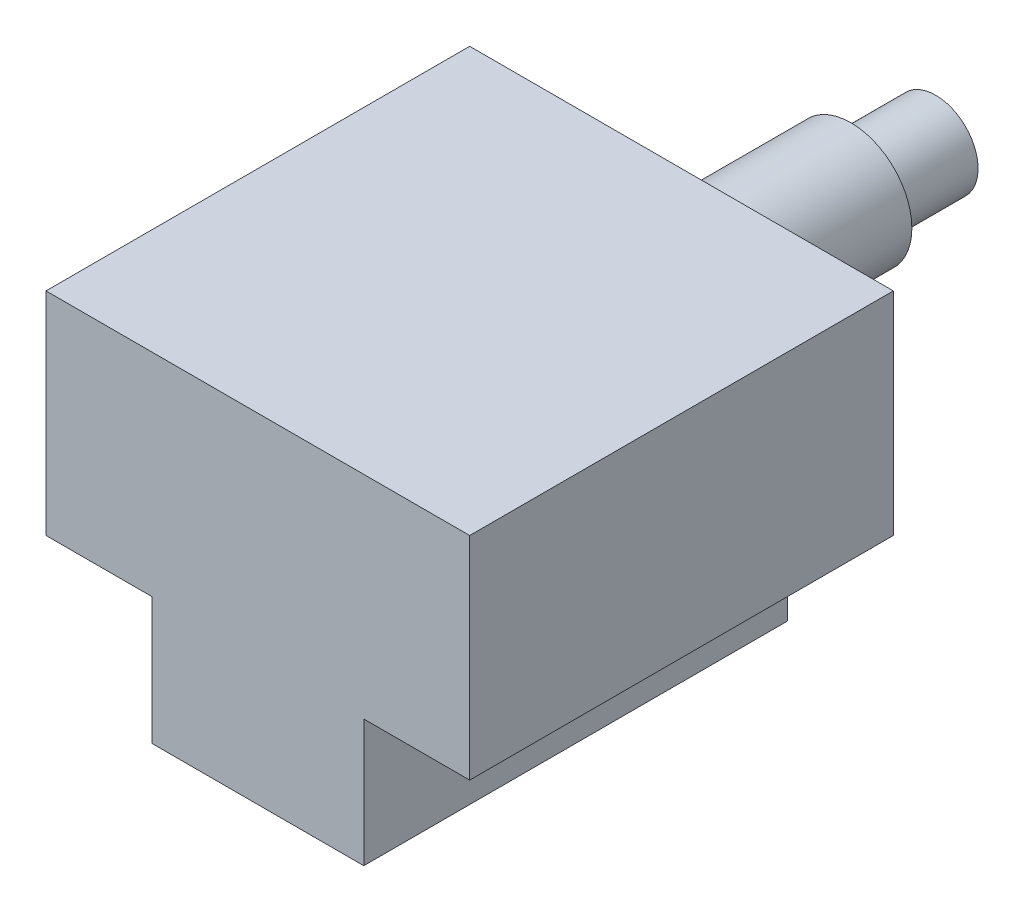
ISO-10303-21;
HEADER;
FILE_DESCRIPTION(('STEP AP214'),'2;1');
FILE_NAME('part.step','',(''),(''),'','','');
FILE_SCHEMA(('AUTOMOTIVE_DESIGN { 1 0 10303 214 1 1 1 1 }'));
ENDSEC;
DATA;
#1=APPLICATION_CONTEXT('core data for automotive mechanical design processes');
#2=APPLICATION_PROTOCOL_DEFINITION('international standard','automotive_design',2000,#1);
#3=PRODUCT_CONTEXT('',#1,'mechanical');
#4=PRODUCT('Part','Part','',(#3));
#5=PRODUCT_RELATED_PRODUCT_CATEGORY('part','',(#4));
#6=PRODUCT_DEFINITION_FORMATION('','',#4);
#7=PRODUCT_DEFINITION_CONTEXT('part definition',#1,'design');
#8=PRODUCT_DEFINITION('design','',#6,#7);
#9=PRODUCT_DEFINITION_SHAPE('','',#8);
#10=(LENGTH_UNIT() NAMED_UNIT(*) SI_UNIT(.MILLI.,.METRE.));
#11=(NAMED_UNIT(*) PLANE_ANGLE_UNIT() SI_UNIT($,.RADIAN.));
#12=(NAMED_UNIT(*) SI_UNIT($,.STERADIAN.) SOLID_ANGLE_UNIT());
#13=UNCERTAINTY_MEASURE_WITH_UNIT(LENGTH_MEASURE(1.E-05),#10,'distance_accuracy_value','');
#14=(GEOMETRIC_REPRESENTATION_CONTEXT(3) GLOBAL_UNCERTAINTY_ASSIGNED_CONTEXT((#13)) GLOBAL_UNIT_ASSIGNED_CONTEXT((#10,
#11,#12)) REPRESENTATION_CONTEXT('',''));
#15=CARTESIAN_POINT('',(0.,0.,0.));
#16=DIRECTION('',(0.,0.,1.));
#17=DIRECTION('',(1.,0.,0.));
#18=AXIS2_PLACEMENT_3D('',#15,#16,#17);
#19=CARTESIAN_POINT('',(50.,0.,50.));
#20=DIRECTION('',(1.,0.,0.));
#21=DIRECTION('',(0.,1.,0.));
#22=AXIS2_PLACEMENT_3D('',#19,#20,#21);
#23=PLANE('',#22);
#24=DIRECTION('',(0.,-1.,0.));
#25=VECTOR('',#24,1.);
#26=CARTESIAN_POINT('',(50.,0.,-50.));
#27=LINE('',#26,#25);
#28=CARTESIAN_POINT('',(50.,25.,-50.));
#29=VERTEX_POINT('',#28);
#30=CARTESIAN_POINT('',(50.,-25.,-50.));
#31=VERTEX_POINT('',#30);
#32=EDGE_CURVE('E139',#29,#31,#27,.T.);
#33=ORIENTED_EDGE('',*,*,#32,.F.);
#34=DIRECTION('',(0.,0.,-1.));
#35=VECTOR('',#34,1.);
#36=CARTESIAN_POINT('',(50.,25.,50.));
#37=LINE('',#36,#35);
#38=CARTESIAN_POINT('',(50.,25.,50.));
#39=VERTEX_POINT('',#38);
#40=EDGE_CURVE('E96',#39,#29,#37,.T.);
#41=ORIENTED_EDGE('',*,*,#40,.F.);
#42=DIRECTION('',(0.,-1.,0.));
#43=VECTOR('',#42,1.);
#44=CARTESIAN_POINT('',(50.,0.,50.));
#45=LINE('',#44,#43);
#46=CARTESIAN_POINT('',(50.,-25.,50.));
#47=VERTEX_POINT('',#46);
#48=EDGE_CURVE('E188',#39,#47,#45,.T.);
#49=ORIENTED_EDGE('',*,*,#48,.T.);
#50=DIRECTION('',(0.,0.,-1.));
#51=VECTOR('',#50,1.);
#52=CARTESIAN_POINT('',(50.,-25.,50.));
#53=LINE('',#52,#51);
#54=EDGE_CURVE('E91',#47,#31,#53,.T.);
#55=ORIENTED_EDGE('',*,*,#54,.T.);
#56=EDGE_LOOP('',(#33,#41,#49,#55));
#57=FACE_BOUND('',#56,.T.);
#58=ADVANCED_FACE('F40',(#57),#23,.T.);
#59=CARTESIAN_POINT('',(0.,25.,50.));
#60=DIRECTION('',(0.,1.,0.));
#61=DIRECTION('',(0.,0.,1.));
#62=AXIS2_PLACEMENT_3D('',#59,#60,#61);
#63=PLANE('',#62);
#64=DIRECTION('',(1.,0.,0.));
#65=VECTOR('',#64,1.);
#66=CARTESIAN_POINT('',(0.,25.,-50.));
#67=LINE('',#66,#65);
#68=CARTESIAN_POINT('',(-50.,25.,-50.));
#69=VERTEX_POINT('',#68);
#70=EDGE_CURVE('E142',#69,#29,#67,.T.);
#71=ORIENTED_EDGE('',*,*,#70,.F.);
#72=DIRECTION('',(0.,0.,-1.));
#73=VECTOR('',#72,1.);
#74=CARTESIAN_POINT('',(-50.,25.,50.));
#75=LINE('',#74,#73);
#76=CARTESIAN_POINT('',(-50.,25.,50.));
#77=VERTEX_POINT('',#76);
#78=EDGE_CURVE('E160',#77,#69,#75,.T.);
#79=ORIENTED_EDGE('',*,*,#78,.F.);
#80=DIRECTION('',(1.,0.,0.));
#81=VECTOR('',#80,1.);
#82=CARTESIAN_POINT('',(0.,25.,50.));
#83=LINE('',#82,#81);
#84=EDGE_CURVE('E190',#77,#39,#83,.T.);
#85=ORIENTED_EDGE('',*,*,#84,.T.);
#86=ORIENTED_EDGE('',*,*,#40,.T.);
#87=EDGE_LOOP('',(#71,#79,#85,#86));
#88=FACE_BOUND('',#87,.T.);
#89=ADVANCED_FACE('F194',(#88),#63,.T.);
#90=CARTESIAN_POINT('',(-50.,0.,50.));
#91=DIRECTION('',(1.,0.,0.));
#92=DIRECTION('',(0.,1.,0.));
#93=AXIS2_PLACEMENT_3D('',#90,#91,#92);
#94=PLANE('',#93);
#95=DIRECTION('',(0.,-1.,0.));
#96=VECTOR('',#95,1.);
#97=CARTESIAN_POINT('',(-50.,0.,-50.));
#98=LINE('',#97,#96);
#99=CARTESIAN_POINT('',(-50.,-25.,-50.));
#100=VERTEX_POINT('',#99);
#101=EDGE_CURVE('E146',#69,#100,#98,.T.);
#102=ORIENTED_EDGE('',*,*,#101,.T.);
#103=DIRECTION('',(0.,0.,-1.));
#104=VECTOR('',#103,1.);
#105=CARTESIAN_POINT('',(-50.,-25.,50.));
#106=LINE('',#105,#104);
#107=CARTESIAN_POINT('',(-50.,-25.,50.));
#108=VERTEX_POINT('',#107);
#109=EDGE_CURVE('E129',#108,#100,#106,.T.);
#110=ORIENTED_EDGE('',*,*,#109,.F.);
#111=DIRECTION('',(0.,-1.,0.));
#112=VECTOR('',#111,1.);
#113=CARTESIAN_POINT('',(-50.,0.,50.));
#114=LINE('',#113,#112);
#115=EDGE_CURVE('E116',#77,#108,#114,.T.);
#116=ORIENTED_EDGE('',*,*,#115,.F.);
#117=ORIENTED_EDGE('',*,*,#78,.T.);
#118=EDGE_LOOP('',(#102,#110,#116,#117));
#119=FACE_BOUND('',#118,.T.);
#120=ADVANCED_FACE('F199',(#119),#94,.F.);
#121=CARTESIAN_POINT('',(0.,-25.,50.));
#122=DIRECTION('',(0.,1.,0.));
#123=DIRECTION('',(0.,0.,1.));
#124=AXIS2_PLACEMENT_3D('',#121,#122,#123);
#125=PLANE('',#124);
#126=DIRECTION('',(1.,0.,0.));
#127=VECTOR('',#126,1.);
#128=CARTESIAN_POINT('',(0.,-25.,-50.));
#129=LINE('',#128,#127);
#130=CARTESIAN_POINT('',(-25.,-25.,-50.));
#131=VERTEX_POINT('',#130);
#132=EDGE_CURVE('E125',#100,#131,#129,.T.);
#133=ORIENTED_EDGE('',*,*,#132,.T.);
#134=DIRECTION('',(0.,0.,-1.));
#135=VECTOR('',#134,1.);
#136=CARTESIAN_POINT('',(-25.,-25.,50.));
#137=LINE('',#136,#135);
#138=CARTESIAN_POINT('',(-25.,-25.,50.));
#139=VERTEX_POINT('',#138);
#140=EDGE_CURVE('E122',#139,#131,#137,.T.);
#141=ORIENTED_EDGE('',*,*,#140,.F.);
#142=DIRECTION('',(1.,0.,0.));
#143=VECTOR('',#142,1.);
#144=CARTESIAN_POINT('',(0.,-25.,50.));
#145=LINE('',#144,#143);
#146=EDGE_CURVE('E107',#108,#139,#145,.T.);
#147=ORIENTED_EDGE('',*,*,#146,.F.);
#148=ORIENTED_EDGE('',*,*,#109,.T.);
#149=EDGE_LOOP('',(#133,#141,#147,#148));
#150=FACE_BOUND('',#149,.T.);
#151=ADVANCED_FACE('F123',(#150),#125,.F.);
#152=CARTESIAN_POINT('',(-25.,0.,50.));
#153=DIRECTION('',(-1.,0.,0.));
#154=DIRECTION('',(0.,0.,1.));
#155=AXIS2_PLACEMENT_3D('',#152,#153,#154);
#156=PLANE('',#155);
#157=DIRECTION('',(0.,1.,0.));
#158=VECTOR('',#157,1.);
#159=CARTESIAN_POINT('',(-25.,0.,-50.));
#160=LINE('',#159,#158);
#161=CARTESIAN_POINT('',(-25.,-55.,-50.));
#162=VERTEX_POINT('',#161);
#163=EDGE_CURVE('E149',#162,#131,#160,.T.);
#164=ORIENTED_EDGE('',*,*,#163,.F.);
#165=DIRECTION('',(0.,0.,-1.));
#166=VECTOR('',#165,1.);
#167=CARTESIAN_POINT('',(-25.,-55.,50.));
#168=LINE('',#167,#166);
#169=CARTESIAN_POINT('',(-25.,-55.,50.));
#170=VERTEX_POINT('',#169);
#171=EDGE_CURVE('E130',#170,#162,#168,.T.);
#172=ORIENTED_EDGE('',*,*,#171,.F.);
#173=DIRECTION('',(0.,1.,0.));
#174=VECTOR('',#173,1.);
#175=CARTESIAN_POINT('',(-25.,0.,50.));
#176=LINE('',#175,#174);
#177=EDGE_CURVE('E113',#170,#139,#176,.T.);
#178=ORIENTED_EDGE('',*,*,#177,.T.);
#179=ORIENTED_EDGE('',*,*,#140,.T.);
#180=EDGE_LOOP('',(#164,#172,#178,#179));
#181=FACE_BOUND('',#180,.T.);
#182=ADVANCED_FACE('F133',(#181),#156,.T.);
#183=CARTESIAN_POINT('',(25.,0.,50.));
#184=DIRECTION('',(-1.,0.,0.));
#185=DIRECTION('',(0.,0.,1.));
#186=AXIS2_PLACEMENT_3D('',#183,#184,#185);
#187=PLANE('',#186);
#188=DIRECTION('',(0.,1.,0.));
#189=VECTOR('',#188,1.);
#190=CARTESIAN_POINT('',(25.,0.,-50.));
#191=LINE('',#190,#189);
#192=CARTESIAN_POINT('',(25.,-55.,-50.));
#193=VERTEX_POINT('',#192);
#194=CARTESIAN_POINT('',(25.,-25.,-50.));
#195=VERTEX_POINT('',#194);
#196=EDGE_CURVE('E84',#193,#195,#191,.T.);
#197=ORIENTED_EDGE('',*,*,#196,.T.);
#198=DIRECTION('',(0.,0.,-1.));
#199=VECTOR('',#198,1.);
#200=CARTESIAN_POINT('',(25.,-25.,50.));
#201=LINE('',#200,#199);
#202=CARTESIAN_POINT('',(25.,-25.,50.));
#203=VERTEX_POINT('',#202);
#204=EDGE_CURVE('E154',#203,#195,#201,.T.);
#205=ORIENTED_EDGE('',*,*,#204,.F.);
#206=DIRECTION('',(0.,1.,0.));
#207=VECTOR('',#206,1.);
#208=CARTESIAN_POINT('',(25.,0.,50.));
#209=LINE('',#208,#207);
#210=CARTESIAN_POINT('',(25.,-55.,50.));
#211=VERTEX_POINT('',#210);
#212=EDGE_CURVE('E134',#211,#203,#209,.T.);
#213=ORIENTED_EDGE('',*,*,#212,.F.);
#214=DIRECTION('',(0.,0.,-1.));
#215=VECTOR('',#214,1.);
#216=CARTESIAN_POINT('',(25.,-55.,50.));
#217=LINE('',#216,#215);
#218=EDGE_CURVE('E156',#211,#193,#217,.T.);
#219=ORIENTED_EDGE('',*,*,#218,.T.);
#220=EDGE_LOOP('',(#197,#205,#213,#219));
#221=FACE_BOUND('',#220,.T.);
#222=ADVANCED_FACE('F208',(#221),#187,.F.);
#223=EDGE_CURVE('E150',#195,#31,#129,.T.);
#224=ORIENTED_EDGE('',*,*,#223,.T.);
#225=ORIENTED_EDGE('',*,*,#54,.F.);
#226=EDGE_CURVE('E57',#203,#47,#145,.T.);
#227=ORIENTED_EDGE('',*,*,#226,.F.);
#228=ORIENTED_EDGE('',*,*,#204,.T.);
#229=EDGE_LOOP('',(#224,#225,#227,#228));
#230=FACE_BOUND('',#229,.T.);
#231=ADVANCED_FACE('F211',(#230),#125,.F.);
#232=CARTESIAN_POINT('',(0.,0.,50.));
#233=DIRECTION('',(0.,0.,1.));
#234=DIRECTION('',(1.,0.,0.));
#235=AXIS2_PLACEMENT_3D('',#232,#233,#234);
#236=PLANE('',#235);
#237=DIRECTION('',(1.,0.,0.));
#238=VECTOR('',#237,1.);
#239=CARTESIAN_POINT('',(50.,-55.,50.));
#240=LINE('',#239,#238);
#241=EDGE_CURVE('E143',#170,#211,#240,.T.);
#242=ORIENTED_EDGE('',*,*,#241,.T.);
#243=ORIENTED_EDGE('',*,*,#212,.T.);
#244=ORIENTED_EDGE('',*,*,#226,.T.);
#245=ORIENTED_EDGE('',*,*,#48,.F.);
#246=ORIENTED_EDGE('',*,*,#84,.F.);
#247=ORIENTED_EDGE('',*,*,#115,.T.);
#248=ORIENTED_EDGE('',*,*,#146,.T.);
#249=ORIENTED_EDGE('',*,*,#177,.F.);
#250=EDGE_LOOP('',(#242,#243,#244,#245,#246,#247,#248,#249));
#251=FACE_BOUND('',#250,.T.);
#252=ADVANCED_FACE('F110',(#251),#236,.T.);
#253=CARTESIAN_POINT('',(0.,0.,-50.));
#254=DIRECTION('',(0.,0.,1.));
#255=DIRECTION('',(1.,0.,0.));
#256=AXIS2_PLACEMENT_3D('',#253,#254,#255);
#257=PLANE('',#256);
#258=CARTESIAN_POINT('',(0.,0.,-50.));
#259=DIRECTION('',(0.,0.,1.));
#260=DIRECTION('',(1.,0.,0.));
#261=AXIS2_PLACEMENT_3D('',#258,#259,#260);
#262=CIRCLE('',#261,14.3732456175911);
#263=CARTESIAN_POINT('',(14.3732456175911,0.,-50.));
#264=VERTEX_POINT('',#263);
#265=EDGE_CURVE('E49',#264,#264,#262,.F.);
#266=ORIENTED_EDGE('',*,*,#265,.F.);
#267=EDGE_LOOP('',(#266));
#268=FACE_BOUND('',#267,.T.);
#269=ORIENTED_EDGE('',*,*,#196,.F.);
#270=DIRECTION('',(-1.,0.,0.));
#271=VECTOR('',#270,1.);
#272=CARTESIAN_POINT('',(0.,-55.,-50.));
#273=LINE('',#272,#271);
#274=EDGE_CURVE('E11',#193,#162,#273,.T.);
#275=ORIENTED_EDGE('',*,*,#274,.T.);
#276=ORIENTED_EDGE('',*,*,#163,.T.);
#277=ORIENTED_EDGE('',*,*,#132,.F.);
#278=ORIENTED_EDGE('',*,*,#101,.F.);
#279=ORIENTED_EDGE('',*,*,#70,.T.);
#280=ORIENTED_EDGE('',*,*,#32,.T.);
#281=ORIENTED_EDGE('',*,*,#223,.F.);
#282=EDGE_LOOP('',(#269,#275,#276,#277,#278,#279,#280,#281));
#283=FACE_BOUND('',#282,.T.);
#284=ADVANCED_FACE('F169',(#268,#283),#257,.F.);
#285=CARTESIAN_POINT('',(0.,0.,-80.));
#286=DIRECTION('',(0.,0.,1.));
#287=DIRECTION('',(1.,0.,0.));
#288=AXIS2_PLACEMENT_3D('',#285,#286,#287);
#289=CYLINDRICAL_SURFACE('',#288,14.3732456175911);
#290=ORIENTED_EDGE('',*,*,#265,.T.);
#291=EDGE_LOOP('',(#290));
#292=FACE_BOUND('',#291,.T.);
#293=CARTESIAN_POINT('',(0.,0.,-90.));
#294=DIRECTION('',(0.,0.,-1.));
#295=DIRECTION('',(-1.,0.,0.));
#296=AXIS2_PLACEMENT_3D('',#293,#294,#295);
#297=CIRCLE('',#296,14.3732456175911);
#298=CARTESIAN_POINT('',(-14.3732456175911,0.,-90.));
#299=VERTEX_POINT('',#298);
#300=EDGE_CURVE('E239',#299,#299,#297,.T.);
#301=ORIENTED_EDGE('',*,*,#300,.F.);
#302=EDGE_LOOP('',(#301));
#303=FACE_BOUND('',#302,.T.);
#304=ADVANCED_FACE('F166',(#292,#303),#289,.T.);
#305=CARTESIAN_POINT('',(50.,-55.,50.));
#306=DIRECTION('',(0.,1.,0.));
#307=DIRECTION('',(0.,0.,1.));
#308=AXIS2_PLACEMENT_3D('',#305,#306,#307);
#309=PLANE('',#308);
#310=ORIENTED_EDGE('',*,*,#171,.T.);
#311=ORIENTED_EDGE('',*,*,#274,.F.);
#312=ORIENTED_EDGE('',*,*,#218,.F.);
#313=ORIENTED_EDGE('',*,*,#241,.F.);
#314=EDGE_LOOP('',(#310,#311,#312,#313));
#315=FACE_BOUND('',#314,.T.);
#316=ADVANCED_FACE('F180',(#315),#309,.F.);
#317=CARTESIAN_POINT('',(0.,0.,-90.));
#318=DIRECTION('',(0.,0.,-1.));
#319=DIRECTION('',(-1.,0.,0.));
#320=AXIS2_PLACEMENT_3D('',#317,#318,#319);
#321=PLANE('',#320);
#322=CARTESIAN_POINT('',(0.,0.,-90.));
#323=DIRECTION('',(0.,0.,-1.));
#324=DIRECTION('',(-1.,0.,0.));
#325=AXIS2_PLACEMENT_3D('',#322,#323,#324);
#326=CIRCLE('',#325,10.);
#327=CARTESIAN_POINT('',(-10.,0.,-90.));
#328=VERTEX_POINT('',#327);
#329=EDGE_CURVE('E43',#328,#328,#326,.T.);
#330=ORIENTED_EDGE('',*,*,#329,.F.);
#331=EDGE_LOOP('',(#330));
#332=FACE_BOUND('',#331,.T.);
#333=ORIENTED_EDGE('',*,*,#300,.T.);
#334=EDGE_LOOP('',(#333));
#335=FACE_BOUND('',#334,.T.);
#336=ADVANCED_FACE('F221',(#332,#335),#321,.T.);
#337=CARTESIAN_POINT('',(0.,0.,-110.));
#338=DIRECTION('',(0.,0.,-1.));
#339=DIRECTION('',(-1.,0.,0.));
#340=AXIS2_PLACEMENT_3D('',#337,#338,#339);
#341=PLANE('',#340);
#342=CARTESIAN_POINT('',(0.,0.,-110.));
#343=DIRECTION('',(0.,0.,-1.));
#344=DIRECTION('',(-1.,0.,0.));
#345=AXIS2_PLACEMENT_3D('',#342,#343,#344);
#346=CIRCLE('',#345,10.);
#347=CARTESIAN_POINT('',(-10.,0.,-110.));
#348=VERTEX_POINT('',#347);
#349=EDGE_CURVE('E182',#348,#348,#346,.T.);
#350=ORIENTED_EDGE('',*,*,#349,.T.);
#351=EDGE_LOOP('',(#350));
#352=FACE_BOUND('',#351,.T.);
#353=ADVANCED_FACE('F225',(#352),#341,.T.);
#354=CARTESIAN_POINT('',(0.,0.,-110.));
#355=DIRECTION('',(0.,0.,1.));
#356=DIRECTION('',(1.,0.,0.));
#357=AXIS2_PLACEMENT_3D('',#354,#355,#356);
#358=CYLINDRICAL_SURFACE('',#357,10.);
#359=ORIENTED_EDGE('',*,*,#329,.T.);
#360=EDGE_LOOP('',(#359));
#361=FACE_BOUND('',#360,.T.);
#362=ORIENTED_EDGE('',*,*,#349,.F.);
#363=EDGE_LOOP('',(#362));
#364=FACE_BOUND('',#363,.T.);
#365=ADVANCED_FACE('F222',(#361,#364),#358,.T.);
#366=CLOSED_SHELL('',(#58,#89,#120,#151,#182,#222,#231,#252,#284,#304,#316,#336,#353,#365));
#367=MANIFOLD_SOLID_BREP('B2',#366);
#368=ADVANCED_BREP_SHAPE_REPRESENTATION('',(#18,#367),#14);
#369=SHAPE_DEFINITION_REPRESENTATION(#9,#368);
ENDSEC;
END-ISO-10303-21;
